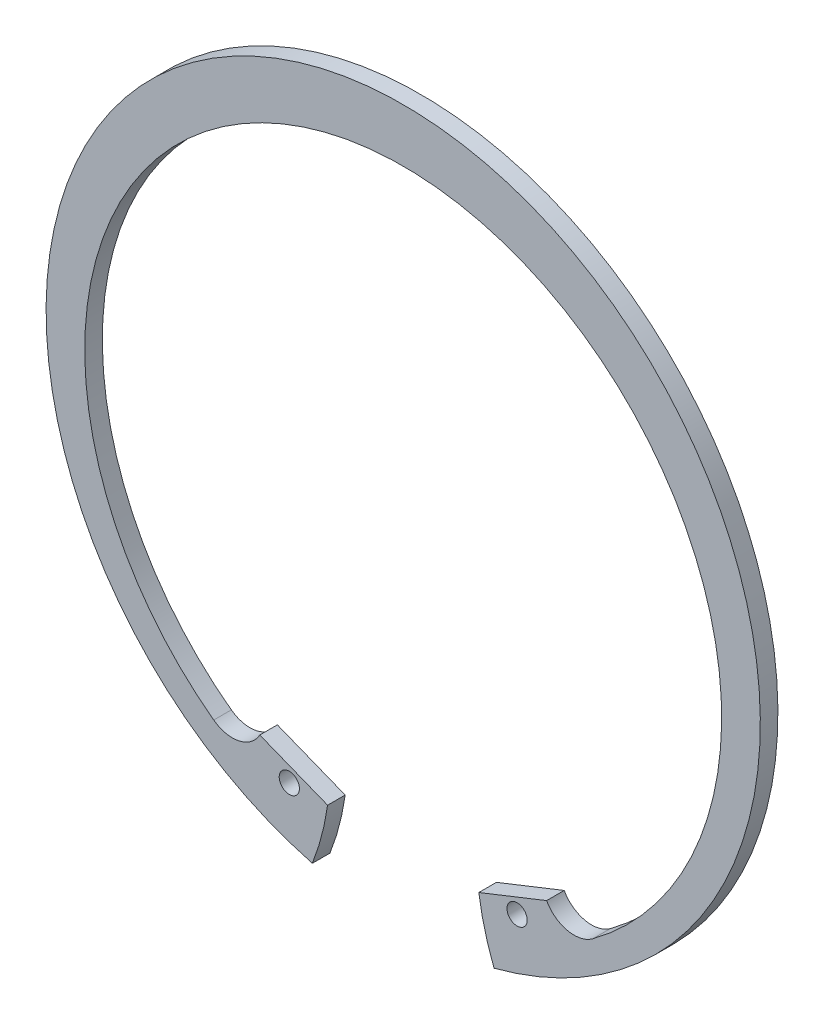
ISO-10303-21;
HEADER;
FILE_DESCRIPTION(('STEP AP214'),'2;1');
FILE_NAME('part.step','',(''),(''),'','','');
FILE_SCHEMA(('AUTOMOTIVE_DESIGN { 1 0 10303 214 1 1 1 1 }'));
ENDSEC;
DATA;
#1=APPLICATION_CONTEXT('core data for automotive mechanical design processes');
#2=APPLICATION_PROTOCOL_DEFINITION('international standard','automotive_design',2000,#1);
#3=PRODUCT_CONTEXT('',#1,'mechanical');
#4=PRODUCT('Part','Part','',(#3));
#5=PRODUCT_RELATED_PRODUCT_CATEGORY('part','',(#4));
#6=PRODUCT_DEFINITION_FORMATION('','',#4);
#7=PRODUCT_DEFINITION_CONTEXT('part definition',#1,'design');
#8=PRODUCT_DEFINITION('design','',#6,#7);
#9=PRODUCT_DEFINITION_SHAPE('','',#8);
#10=(LENGTH_UNIT() NAMED_UNIT(*) SI_UNIT(.MILLI.,.METRE.));
#11=(NAMED_UNIT(*) PLANE_ANGLE_UNIT() SI_UNIT($,.RADIAN.));
#12=(NAMED_UNIT(*) SI_UNIT($,.STERADIAN.) SOLID_ANGLE_UNIT());
#13=UNCERTAINTY_MEASURE_WITH_UNIT(LENGTH_MEASURE(1.E-05),#10,'distance_accuracy_value','');
#14=(GEOMETRIC_REPRESENTATION_CONTEXT(3) GLOBAL_UNCERTAINTY_ASSIGNED_CONTEXT((#13)) GLOBAL_UNIT_ASSIGNED_CONTEXT((#10,
#11,#12)) REPRESENTATION_CONTEXT('',''));
#15=CARTESIAN_POINT('',(0.,0.,0.));
#16=DIRECTION('',(0.,0.,1.));
#17=DIRECTION('',(1.,0.,0.));
#18=AXIS2_PLACEMENT_3D('',#15,#16,#17);
#19=CARTESIAN_POINT('',(0.,0.,-1.3843));
#20=DIRECTION('',(0.,0.,1.));
#21=DIRECTION('',(1.,0.,0.));
#22=AXIS2_PLACEMENT_3D('',#19,#20,#21);
#23=CYLINDRICAL_SURFACE('',#22,56.1848);
#24=CARTESIAN_POINT('',(0.,0.,1.3843));
#25=DIRECTION('',(0.,0.,1.));
#26=DIRECTION('',(-1.,0.,0.));
#27=AXIS2_PLACEMENT_3D('',#24,#25,#26);
#28=CIRCLE('',#27,56.1848);
#29=CARTESIAN_POINT('',(14.2935073691318,-54.3362438721023,1.3843));
#30=VERTEX_POINT('',#29);
#31=CARTESIAN_POINT('',(-14.2935073691318,-54.3362438721023,1.3843));
#32=VERTEX_POINT('',#31);
#33=EDGE_CURVE('E159',#30,#32,#28,.T.);
#34=ORIENTED_EDGE('',*,*,#33,.F.);
#35=DIRECTION('',(0.,0.,1.));
#36=VECTOR('',#35,1.);
#37=CARTESIAN_POINT('',(14.2935073691318,-54.3362438721023,-1.3843));
#38=LINE('',#37,#36);
#39=CARTESIAN_POINT('',(14.2935073691318,-54.3362438721023,-1.3843));
#40=VERTEX_POINT('',#39);
#41=EDGE_CURVE('E99',#40,#30,#38,.T.);
#42=ORIENTED_EDGE('',*,*,#41,.F.);
#43=CARTESIAN_POINT('',(0.,0.,-1.3843));
#44=DIRECTION('',(0.,0.,1.));
#45=DIRECTION('',(-1.,0.,0.));
#46=AXIS2_PLACEMENT_3D('',#43,#44,#45);
#47=CIRCLE('',#46,56.1848);
#48=CARTESIAN_POINT('',(-14.2935073691318,-54.3362438721023,-1.3843));
#49=VERTEX_POINT('',#48);
#50=EDGE_CURVE('E123',#40,#49,#47,.T.);
#51=ORIENTED_EDGE('',*,*,#50,.T.);
#52=DIRECTION('',(0.,0.,1.));
#53=VECTOR('',#52,1.);
#54=CARTESIAN_POINT('',(-14.2935073691318,-54.3362438721023,-1.3843));
#55=LINE('',#54,#53);
#56=EDGE_CURVE('E170',#49,#32,#55,.T.);
#57=ORIENTED_EDGE('',*,*,#56,.T.);
#58=EDGE_LOOP('',(#34,#42,#51,#57));
#59=FACE_BOUND('',#58,.T.);
#60=ADVANCED_FACE('F32',(#59),#23,.T.);
#61=CARTESIAN_POINT('',(11.6586,-45.3109445970838,-1.3843));
#62=DIRECTION('',(-0.368630462068959,0.929576022945313,0.));
#63=DIRECTION('',(-0.929576022945313,-0.368630462068959,0.));
#64=AXIS2_PLACEMENT_3D('',#61,#62,#63);
#65=PLANE('',#64);
#66=DIRECTION('',(-0.929576022945313,-0.368630462068959,0.));
#67=VECTOR('',#66,1.);
#68=CARTESIAN_POINT('',(11.6586,-45.3109445970838,-1.3843));
#69=LINE('',#68,#67);
#70=CARTESIAN_POINT('',(22.5633437023769,-40.9865853079811,-1.3843));
#71=VERTEX_POINT('',#70);
#72=CARTESIAN_POINT('',(11.8947123098281,-45.2173124597183,-1.3843));
#73=VERTEX_POINT('',#72);
#74=EDGE_CURVE('E104',#71,#73,#69,.T.);
#75=ORIENTED_EDGE('',*,*,#74,.T.);
#76=DIRECTION('',(0.,0.,1.));
#77=VECTOR('',#76,1.);
#78=CARTESIAN_POINT('',(11.8947123098281,-45.2173124597183,-1.3843));
#79=LINE('',#78,#77);
#80=CARTESIAN_POINT('',(11.8947123098281,-45.2173124597183,1.3843));
#81=VERTEX_POINT('',#80);
#82=EDGE_CURVE('E97',#73,#81,#79,.T.);
#83=ORIENTED_EDGE('',*,*,#82,.T.);
#84=DIRECTION('',(-0.929576022945313,-0.368630462068959,0.));
#85=VECTOR('',#84,1.);
#86=CARTESIAN_POINT('',(11.6586,-45.3109445970838,1.3843));
#87=LINE('',#86,#85);
#88=CARTESIAN_POINT('',(22.5633437023769,-40.9865853079811,1.3843));
#89=VERTEX_POINT('',#88);
#90=EDGE_CURVE('E103',#89,#81,#87,.T.);
#91=ORIENTED_EDGE('',*,*,#90,.F.);
#92=DIRECTION('',(0.,0.,1.));
#93=VECTOR('',#92,1.);
#94=CARTESIAN_POINT('',(22.5633437023769,-40.9865853079811,-1.3843));
#95=LINE('',#94,#93);
#96=EDGE_CURVE('E53',#71,#89,#95,.T.);
#97=ORIENTED_EDGE('',*,*,#96,.F.);
#98=EDGE_LOOP('',(#75,#83,#91,#97));
#99=FACE_BOUND('',#98,.T.);
#100=ADVANCED_FACE('F102',(#99),#65,.T.);
#101=CARTESIAN_POINT('',(0.,0.,-1.3843));
#102=DIRECTION('',(0.,0.,-1.));
#103=DIRECTION('',(-1.,0.,0.));
#104=AXIS2_PLACEMENT_3D('',#101,#102,#103);
#105=PLANE('',#104);
#106=CARTESIAN_POINT('',(17.9186996621458,-45.1856134590772,-1.3843));
#107=DIRECTION('',(0.,0.,1.));
#108=DIRECTION('',(-1.,0.,0.));
#109=AXIS2_PLACEMENT_3D('',#106,#107,#108);
#110=CIRCLE('',#109,1.5875);
#111=CARTESIAN_POINT('',(16.3311996621458,-45.1856134590772,-1.3843));
#112=VERTEX_POINT('',#111);
#113=EDGE_CURVE('E112',#112,#112,#110,.T.);
#114=ORIENTED_EDGE('',*,*,#113,.T.);
#115=EDGE_LOOP('',(#114));
#116=FACE_BOUND('',#115,.T.);
#117=CARTESIAN_POINT('',(-17.9186996621458,-45.1856134590772,-1.3843));
#118=DIRECTION('',(0.,0.,1.));
#119=DIRECTION('',(1.,0.,0.));
#120=AXIS2_PLACEMENT_3D('',#117,#118,#119);
#121=CIRCLE('',#120,1.5875);
#122=CARTESIAN_POINT('',(-16.3311996621458,-45.1856134590772,-1.3843));
#123=VERTEX_POINT('',#122);
#124=EDGE_CURVE('E115',#123,#123,#121,.T.);
#125=ORIENTED_EDGE('',*,*,#124,.T.);
#126=EDGE_LOOP('',(#125));
#127=FACE_BOUND('',#126,.T.);
#128=ORIENTED_EDGE('',*,*,#50,.F.);
#129=CARTESIAN_POINT('',(51.7861890995852,-39.5985714916854,-1.3843));
#130=DIRECTION('',(0.,0.,1.));
#131=DIRECTION('',(1.,0.,0.));
#132=AXIS2_PLACEMENT_3D('',#129,#130,#131);
#133=CIRCLE('',#132,40.2852351430842);
#134=EDGE_CURVE('E105',#73,#40,#133,.T.);
#135=ORIENTED_EDGE('',*,*,#134,.F.);
#136=ORIENTED_EDGE('',*,*,#74,.F.);
#137=CARTESIAN_POINT('',(26.8777737682363,-38.6114675048178,-1.3843));
#138=DIRECTION('',(0.,0.,-1.));
#139=DIRECTION('',(-1.,0.,0.));
#140=AXIS2_PLACEMENT_3D('',#137,#138,#139);
#141=CIRCLE('',#140,4.92498643369648);
#142=CARTESIAN_POINT('',(29.8078496748654,-42.5700210984282,-1.3843));
#143=VERTEX_POINT('',#142);
#144=EDGE_CURVE('E133',#143,#71,#141,.T.);
#145=ORIENTED_EDGE('',*,*,#144,.F.);
#146=CARTESIAN_POINT('',(0.,-2.29940210822537,-1.3843));
#147=DIRECTION('',(0.,0.,-1.));
#148=DIRECTION('',(-1.,0.,0.));
#149=AXIS2_PLACEMENT_3D('',#146,#147,#148);
#150=CIRCLE('',#149,50.1022021082254);
#151=CARTESIAN_POINT('',(-29.8078496748655,-42.5700210984282,-1.3843));
#152=VERTEX_POINT('',#151);
#153=EDGE_CURVE('E130',#152,#143,#150,.T.);
#154=ORIENTED_EDGE('',*,*,#153,.F.);
#155=CARTESIAN_POINT('',(-26.8777737682363,-38.6114675048178,-1.3843));
#156=DIRECTION('',(0.,0.,-1.));
#157=DIRECTION('',(1.,0.,0.));
#158=AXIS2_PLACEMENT_3D('',#155,#156,#157);
#159=CIRCLE('',#158,4.92498643369648);
#160=CARTESIAN_POINT('',(-22.5633437023769,-40.9865853079811,-1.3843));
#161=VERTEX_POINT('',#160);
#162=EDGE_CURVE('E127',#161,#152,#159,.T.);
#163=ORIENTED_EDGE('',*,*,#162,.F.);
#164=DIRECTION('',(-0.929576022945313,0.368630462068959,0.));
#165=VECTOR('',#164,1.);
#166=CARTESIAN_POINT('',(-11.6586,-45.3109445970838,-1.3843));
#167=LINE('',#166,#165);
#168=CARTESIAN_POINT('',(-11.8947123098281,-45.2173124597183,-1.3843));
#169=VERTEX_POINT('',#168);
#170=EDGE_CURVE('E125',#169,#161,#167,.T.);
#171=ORIENTED_EDGE('',*,*,#170,.F.);
#172=CARTESIAN_POINT('',(-51.7861890995852,-39.5985714916854,-1.3843));
#173=DIRECTION('',(0.,0.,-1.));
#174=DIRECTION('',(-1.,0.,0.));
#175=AXIS2_PLACEMENT_3D('',#172,#173,#174);
#176=CIRCLE('',#175,40.2852351430842);
#177=EDGE_CURVE('E173',#169,#49,#176,.T.);
#178=ORIENTED_EDGE('',*,*,#177,.T.);
#179=EDGE_LOOP('',(#128,#135,#136,#145,#154,#163,#171,#178));
#180=FACE_BOUND('',#179,.T.);
#181=ADVANCED_FACE('F182',(#116,#127,#180),#105,.T.);
#182=CARTESIAN_POINT('',(0.,0.,1.3843));
#183=DIRECTION('',(0.,0.,-1.));
#184=DIRECTION('',(-1.,0.,0.));
#185=AXIS2_PLACEMENT_3D('',#182,#183,#184);
#186=PLANE('',#185);
#187=CARTESIAN_POINT('',(-17.9186996621458,-45.1856134590772,1.3843));
#188=DIRECTION('',(0.,0.,1.));
#189=DIRECTION('',(1.,0.,0.));
#190=AXIS2_PLACEMENT_3D('',#187,#188,#189);
#191=CIRCLE('',#190,1.5875);
#192=CARTESIAN_POINT('',(-16.3311996621458,-45.1856134590772,1.3843));
#193=VERTEX_POINT('',#192);
#194=EDGE_CURVE('E163',#193,#193,#191,.T.);
#195=ORIENTED_EDGE('',*,*,#194,.F.);
#196=EDGE_LOOP('',(#195));
#197=FACE_BOUND('',#196,.T.);
#198=CARTESIAN_POINT('',(17.9186996621458,-45.1856134590772,1.3843));
#199=DIRECTION('',(0.,0.,1.));
#200=DIRECTION('',(-1.,0.,0.));
#201=AXIS2_PLACEMENT_3D('',#198,#199,#200);
#202=CIRCLE('',#201,1.5875);
#203=CARTESIAN_POINT('',(16.3311996621458,-45.1856134590772,1.3843));
#204=VERTEX_POINT('',#203);
#205=EDGE_CURVE('E166',#204,#204,#202,.T.);
#206=ORIENTED_EDGE('',*,*,#205,.F.);
#207=EDGE_LOOP('',(#206));
#208=FACE_BOUND('',#207,.T.);
#209=CARTESIAN_POINT('',(51.7861890995852,-39.5985714916854,1.3843));
#210=DIRECTION('',(0.,0.,-1.));
#211=DIRECTION('',(-1.,0.,0.));
#212=AXIS2_PLACEMENT_3D('',#209,#210,#211);
#213=CIRCLE('',#212,40.2852351430842);
#214=EDGE_CURVE('E11',#30,#81,#213,.T.);
#215=ORIENTED_EDGE('',*,*,#214,.F.);
#216=ORIENTED_EDGE('',*,*,#33,.T.);
#217=CARTESIAN_POINT('',(-51.7861890995852,-39.5985714916854,1.3843));
#218=DIRECTION('',(0.,0.,-1.));
#219=DIRECTION('',(-1.,0.,0.));
#220=AXIS2_PLACEMENT_3D('',#217,#218,#219);
#221=CIRCLE('',#220,40.2852351430842);
#222=CARTESIAN_POINT('',(-11.8947123098281,-45.2173124597183,1.3843));
#223=VERTEX_POINT('',#222);
#224=EDGE_CURVE('E39',#32,#223,#221,.F.);
#225=ORIENTED_EDGE('',*,*,#224,.T.);
#226=DIRECTION('',(-0.929576022945313,0.368630462068959,0.));
#227=VECTOR('',#226,1.);
#228=CARTESIAN_POINT('',(-11.6586,-45.3109445970838,1.3843));
#229=LINE('',#228,#227);
#230=CARTESIAN_POINT('',(-22.5633437023769,-40.9865853079811,1.3843));
#231=VERTEX_POINT('',#230);
#232=EDGE_CURVE('E150',#223,#231,#229,.T.);
#233=ORIENTED_EDGE('',*,*,#232,.T.);
#234=CARTESIAN_POINT('',(-26.8777737682363,-38.6114675048178,1.3843));
#235=DIRECTION('',(0.,0.,-1.));
#236=DIRECTION('',(1.,0.,0.));
#237=AXIS2_PLACEMENT_3D('',#234,#235,#236);
#238=CIRCLE('',#237,4.92498643369648);
#239=CARTESIAN_POINT('',(-29.8078496748655,-42.5700210984282,1.3843));
#240=VERTEX_POINT('',#239);
#241=EDGE_CURVE('E155',#231,#240,#238,.T.);
#242=ORIENTED_EDGE('',*,*,#241,.T.);
#243=CARTESIAN_POINT('',(0.,-2.29940210822537,1.3843));
#244=DIRECTION('',(0.,0.,-1.));
#245=DIRECTION('',(-1.,0.,0.));
#246=AXIS2_PLACEMENT_3D('',#243,#244,#245);
#247=CIRCLE('',#246,50.1022021082254);
#248=CARTESIAN_POINT('',(29.8078496748654,-42.5700210984282,1.3843));
#249=VERTEX_POINT('',#248);
#250=EDGE_CURVE('E117',#240,#249,#247,.T.);
#251=ORIENTED_EDGE('',*,*,#250,.T.);
#252=CARTESIAN_POINT('',(26.8777737682363,-38.6114675048178,1.3843));
#253=DIRECTION('',(0.,0.,-1.));
#254=DIRECTION('',(-1.,0.,0.));
#255=AXIS2_PLACEMENT_3D('',#252,#253,#254);
#256=CIRCLE('',#255,4.92498643369648);
#257=EDGE_CURVE('E111',#249,#89,#256,.T.);
#258=ORIENTED_EDGE('',*,*,#257,.T.);
#259=ORIENTED_EDGE('',*,*,#90,.T.);
#260=EDGE_LOOP('',(#215,#216,#225,#233,#242,#251,#258,#259));
#261=FACE_BOUND('',#260,.T.);
#262=ADVANCED_FACE('F108',(#197,#208,#261),#186,.F.);
#263=CARTESIAN_POINT('',(26.8777737682363,-38.6114675048178,-1.3843));
#264=DIRECTION('',(0.,0.,1.));
#265=DIRECTION('',(1.,0.,0.));
#266=AXIS2_PLACEMENT_3D('',#263,#264,#265);
#267=CYLINDRICAL_SURFACE('',#266,4.92498643369648);
#268=ORIENTED_EDGE('',*,*,#96,.T.);
#269=ORIENTED_EDGE('',*,*,#257,.F.);
#270=DIRECTION('',(0.,0.,1.));
#271=VECTOR('',#270,1.);
#272=CARTESIAN_POINT('',(29.8078496748654,-42.5700210984282,-1.3843));
#273=LINE('',#272,#271);
#274=EDGE_CURVE('E139',#143,#249,#273,.T.);
#275=ORIENTED_EDGE('',*,*,#274,.F.);
#276=ORIENTED_EDGE('',*,*,#144,.T.);
#277=EDGE_LOOP('',(#268,#269,#275,#276));
#278=FACE_BOUND('',#277,.T.);
#279=ADVANCED_FACE('F209',(#278),#267,.F.);
#280=CARTESIAN_POINT('',(0.,-2.29940210822537,-1.3843));
#281=DIRECTION('',(0.,0.,1.));
#282=DIRECTION('',(1.,0.,0.));
#283=AXIS2_PLACEMENT_3D('',#280,#281,#282);
#284=CYLINDRICAL_SURFACE('',#283,50.1022021082254);
#285=ORIENTED_EDGE('',*,*,#274,.T.);
#286=ORIENTED_EDGE('',*,*,#250,.F.);
#287=DIRECTION('',(0.,0.,1.));
#288=VECTOR('',#287,1.);
#289=CARTESIAN_POINT('',(-29.8078496748655,-42.5700210984282,-1.3843));
#290=LINE('',#289,#288);
#291=EDGE_CURVE('E141',#152,#240,#290,.T.);
#292=ORIENTED_EDGE('',*,*,#291,.F.);
#293=ORIENTED_EDGE('',*,*,#153,.T.);
#294=EDGE_LOOP('',(#285,#286,#292,#293));
#295=FACE_BOUND('',#294,.T.);
#296=ADVANCED_FACE('F212',(#295),#284,.F.);
#297=CARTESIAN_POINT('',(-26.8777737682363,-38.6114675048178,-1.3843));
#298=DIRECTION('',(0.,0.,1.));
#299=DIRECTION('',(1.,0.,0.));
#300=AXIS2_PLACEMENT_3D('',#297,#298,#299);
#301=CYLINDRICAL_SURFACE('',#300,4.92498643369648);
#302=ORIENTED_EDGE('',*,*,#291,.T.);
#303=ORIENTED_EDGE('',*,*,#241,.F.);
#304=DIRECTION('',(0.,0.,1.));
#305=VECTOR('',#304,1.);
#306=CARTESIAN_POINT('',(-22.5633437023769,-40.9865853079811,-1.3843));
#307=LINE('',#306,#305);
#308=EDGE_CURVE('E137',#161,#231,#307,.T.);
#309=ORIENTED_EDGE('',*,*,#308,.F.);
#310=ORIENTED_EDGE('',*,*,#162,.T.);
#311=EDGE_LOOP('',(#302,#303,#309,#310));
#312=FACE_BOUND('',#311,.T.);
#313=ADVANCED_FACE('F156',(#312),#301,.F.);
#314=CARTESIAN_POINT('',(-11.6586,-45.3109445970838,-1.3843));
#315=DIRECTION('',(0.368630462068959,0.929576022945313,0.));
#316=DIRECTION('',(-0.929576022945313,0.368630462068959,0.));
#317=AXIS2_PLACEMENT_3D('',#314,#315,#316);
#318=PLANE('',#317);
#319=DIRECTION('',(0.,0.,1.));
#320=VECTOR('',#319,1.);
#321=CARTESIAN_POINT('',(-11.8947123098281,-45.2173124597183,-1.3843));
#322=LINE('',#321,#320);
#323=EDGE_CURVE('E169',#169,#223,#322,.T.);
#324=ORIENTED_EDGE('',*,*,#323,.F.);
#325=ORIENTED_EDGE('',*,*,#170,.T.);
#326=ORIENTED_EDGE('',*,*,#308,.T.);
#327=ORIENTED_EDGE('',*,*,#232,.F.);
#328=EDGE_LOOP('',(#324,#325,#326,#327));
#329=FACE_BOUND('',#328,.T.);
#330=ADVANCED_FACE('F149',(#329),#318,.T.);
#331=CARTESIAN_POINT('',(-17.9186996621458,-45.1856134590772,-1.3843));
#332=DIRECTION('',(0.,0.,1.));
#333=DIRECTION('',(1.,0.,0.));
#334=AXIS2_PLACEMENT_3D('',#331,#332,#333);
#335=CYLINDRICAL_SURFACE('',#334,1.5875);
#336=ORIENTED_EDGE('',*,*,#124,.F.);
#337=EDGE_LOOP('',(#336));
#338=FACE_BOUND('',#337,.T.);
#339=ORIENTED_EDGE('',*,*,#194,.T.);
#340=EDGE_LOOP('',(#339));
#341=FACE_BOUND('',#340,.T.);
#342=ADVANCED_FACE('F193',(#338,#341),#335,.F.);
#343=CARTESIAN_POINT('',(17.9186996621458,-45.1856134590772,-1.3843));
#344=DIRECTION('',(0.,0.,1.));
#345=DIRECTION('',(1.,0.,0.));
#346=AXIS2_PLACEMENT_3D('',#343,#344,#345);
#347=CYLINDRICAL_SURFACE('',#346,1.5875);
#348=ORIENTED_EDGE('',*,*,#113,.F.);
#349=EDGE_LOOP('',(#348));
#350=FACE_BOUND('',#349,.T.);
#351=ORIENTED_EDGE('',*,*,#205,.T.);
#352=EDGE_LOOP('',(#351));
#353=FACE_BOUND('',#352,.T.);
#354=ADVANCED_FACE('F186',(#350,#353),#347,.F.);
#355=CARTESIAN_POINT('',(-51.7861890995852,-39.5985714916854,-1.3843));
#356=DIRECTION('',(0.,0.,1.));
#357=DIRECTION('',(1.,0.,0.));
#358=AXIS2_PLACEMENT_3D('',#355,#356,#357);
#359=CYLINDRICAL_SURFACE('',#358,40.2852351430842);
#360=ORIENTED_EDGE('',*,*,#224,.F.);
#361=ORIENTED_EDGE('',*,*,#56,.F.);
#362=ORIENTED_EDGE('',*,*,#177,.F.);
#363=ORIENTED_EDGE('',*,*,#323,.T.);
#364=EDGE_LOOP('',(#360,#361,#362,#363));
#365=FACE_BOUND('',#364,.T.);
#366=ADVANCED_FACE('F184',(#365),#359,.T.);
#367=CARTESIAN_POINT('',(51.7861890995852,-39.5985714916854,-1.3843));
#368=DIRECTION('',(0.,0.,1.));
#369=DIRECTION('',(1.,0.,0.));
#370=AXIS2_PLACEMENT_3D('',#367,#368,#369);
#371=CYLINDRICAL_SURFACE('',#370,40.2852351430842);
#372=ORIENTED_EDGE('',*,*,#82,.F.);
#373=ORIENTED_EDGE('',*,*,#134,.T.);
#374=ORIENTED_EDGE('',*,*,#41,.T.);
#375=ORIENTED_EDGE('',*,*,#214,.T.);
#376=EDGE_LOOP('',(#372,#373,#374,#375));
#377=FACE_BOUND('',#376,.T.);
#378=ADVANCED_FACE('F96',(#377),#371,.T.);
#379=CLOSED_SHELL('',(#60,#100,#181,#262,#279,#296,#313,#330,#342,#354,#366,#378));
#380=MANIFOLD_SOLID_BREP('B2',#379);
#381=ADVANCED_BREP_SHAPE_REPRESENTATION('',(#18,#380),#14);
#382=SHAPE_DEFINITION_REPRESENTATION(#9,#381);
ENDSEC;
END-ISO-10303-21;
